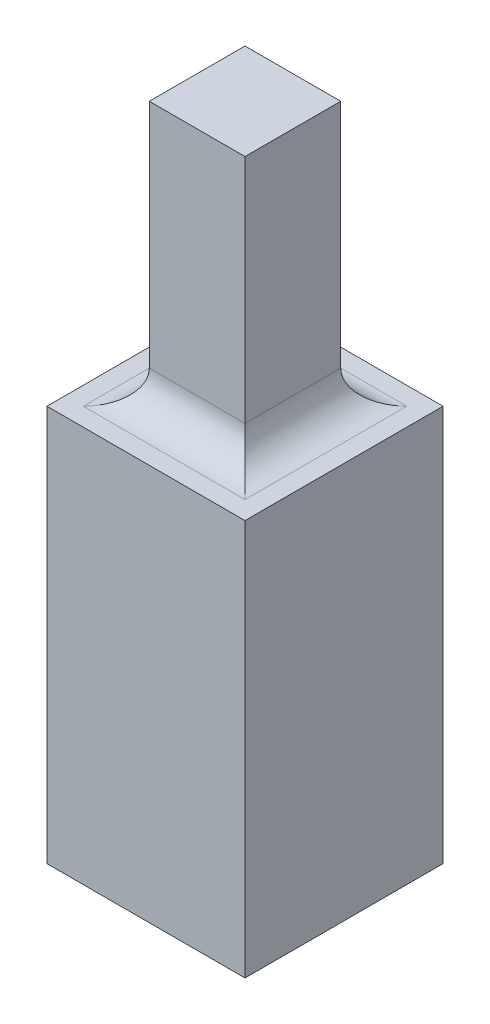
ISO-10303-21;
HEADER;
FILE_DESCRIPTION(('STEP AP214'),'2;1');
FILE_NAME('part.step','',(''),(''),'','','');
FILE_SCHEMA(('AUTOMOTIVE_DESIGN { 1 0 10303 214 1 1 1 1 }'));
ENDSEC;
DATA;
#1=APPLICATION_CONTEXT('core data for automotive mechanical design processes');
#2=APPLICATION_PROTOCOL_DEFINITION('international standard','automotive_design',2000,#1);
#3=PRODUCT_CONTEXT('',#1,'mechanical');
#4=PRODUCT('Part','Part','',(#3));
#5=PRODUCT_RELATED_PRODUCT_CATEGORY('part','',(#4));
#6=PRODUCT_DEFINITION_FORMATION('','',#4);
#7=PRODUCT_DEFINITION_CONTEXT('part definition',#1,'design');
#8=PRODUCT_DEFINITION('design','',#6,#7);
#9=PRODUCT_DEFINITION_SHAPE('','',#8);
#10=(LENGTH_UNIT() NAMED_UNIT(*) SI_UNIT(.MILLI.,.METRE.));
#11=(NAMED_UNIT(*) PLANE_ANGLE_UNIT() SI_UNIT($,.RADIAN.));
#12=(NAMED_UNIT(*) SI_UNIT($,.STERADIAN.) SOLID_ANGLE_UNIT());
#13=UNCERTAINTY_MEASURE_WITH_UNIT(LENGTH_MEASURE(1.E-05),#10,'distance_accuracy_value','');
#14=(GEOMETRIC_REPRESENTATION_CONTEXT(3) GLOBAL_UNCERTAINTY_ASSIGNED_CONTEXT((#13)) GLOBAL_UNIT_ASSIGNED_CONTEXT((#10,
#11,#12)) REPRESENTATION_CONTEXT('',''));
#15=CARTESIAN_POINT('',(0.,0.,0.));
#16=DIRECTION('',(0.,0.,1.));
#17=DIRECTION('',(1.,0.,0.));
#18=AXIS2_PLACEMENT_3D('',#15,#16,#17);
#19=CARTESIAN_POINT('',(0.,60.,0.));
#20=DIRECTION('',(0.,-1.,0.));
#21=DIRECTION('',(0.,0.,-1.));
#22=AXIS2_PLACEMENT_3D('',#19,#20,#21);
#23=PLANE('',#22);
#24=DIRECTION('',(-1.,0.,0.));
#25=VECTOR('',#24,1.);
#26=CARTESIAN_POINT('',(7.25,60.,-12.25));
#27=LINE('',#26,#25);
#28=CARTESIAN_POINT('',(-12.25,60.,-12.25));
#29=VERTEX_POINT('',#28);
#30=CARTESIAN_POINT('',(12.25,60.,-12.25));
#31=VERTEX_POINT('',#30);
#32=EDGE_CURVE('E199',#29,#31,#27,.F.);
#33=ORIENTED_EDGE('',*,*,#32,.T.);
#34=DIRECTION('',(0.,0.,-1.));
#35=VECTOR('',#34,1.);
#36=CARTESIAN_POINT('',(12.25,60.,7.25));
#37=LINE('',#36,#35);
#38=CARTESIAN_POINT('',(12.25,60.,12.25));
#39=VERTEX_POINT('',#38);
#40=EDGE_CURVE('E202',#31,#39,#37,.F.);
#41=ORIENTED_EDGE('',*,*,#40,.T.);
#42=DIRECTION('',(1.,0.,0.));
#43=VECTOR('',#42,1.);
#44=CARTESIAN_POINT('',(-7.25,60.,12.25));
#45=LINE('',#44,#43);
#46=CARTESIAN_POINT('',(-12.25,60.,12.25));
#47=VERTEX_POINT('',#46);
#48=EDGE_CURVE('E193',#39,#47,#45,.F.);
#49=ORIENTED_EDGE('',*,*,#48,.T.);
#50=DIRECTION('',(0.,0.,1.));
#51=VECTOR('',#50,1.);
#52=CARTESIAN_POINT('',(-12.25,60.,-7.25));
#53=LINE('',#52,#51);
#54=EDGE_CURVE('E196',#47,#29,#53,.F.);
#55=ORIENTED_EDGE('',*,*,#54,.T.);
#56=EDGE_LOOP('',(#33,#41,#49,#55));
#57=FACE_BOUND('',#56,.T.);
#58=DIRECTION('',(0.,0.,-1.));
#59=VECTOR('',#58,1.);
#60=CARTESIAN_POINT('',(15.,60.,15.));
#61=LINE('',#60,#59);
#62=CARTESIAN_POINT('',(15.,60.,15.));
#63=VERTEX_POINT('',#62);
#64=CARTESIAN_POINT('',(15.,60.,-15.));
#65=VERTEX_POINT('',#64);
#66=EDGE_CURVE('E154',#63,#65,#61,.T.);
#67=ORIENTED_EDGE('',*,*,#66,.T.);
#68=DIRECTION('',(-1.,0.,0.));
#69=VECTOR('',#68,1.);
#70=CARTESIAN_POINT('',(-15.,60.,-15.));
#71=LINE('',#70,#69);
#72=CARTESIAN_POINT('',(-15.,60.,-15.));
#73=VERTEX_POINT('',#72);
#74=EDGE_CURVE('E158',#65,#73,#71,.T.);
#75=ORIENTED_EDGE('',*,*,#74,.T.);
#76=DIRECTION('',(0.,0.,1.));
#77=VECTOR('',#76,1.);
#78=CARTESIAN_POINT('',(-15.,60.,15.));
#79=LINE('',#78,#77);
#80=CARTESIAN_POINT('',(-15.,60.,15.));
#81=VERTEX_POINT('',#80);
#82=EDGE_CURVE('E162',#73,#81,#79,.T.);
#83=ORIENTED_EDGE('',*,*,#82,.T.);
#84=DIRECTION('',(1.,0.,0.));
#85=VECTOR('',#84,1.);
#86=CARTESIAN_POINT('',(-15.,60.,15.));
#87=LINE('',#86,#85);
#88=EDGE_CURVE('E165',#81,#63,#87,.T.);
#89=ORIENTED_EDGE('',*,*,#88,.T.);
#90=EDGE_LOOP('',(#67,#75,#83,#89));
#91=FACE_BOUND('',#90,.T.);
#92=ADVANCED_FACE('F39',(#57,#91),#23,.F.);
#93=CARTESIAN_POINT('',(15.,60.,15.));
#94=DIRECTION('',(-1.,0.,0.));
#95=DIRECTION('',(0.,0.,1.));
#96=AXIS2_PLACEMENT_3D('',#93,#94,#95);
#97=PLANE('',#96);
#98=DIRECTION('',(0.,0.,-1.));
#99=VECTOR('',#98,1.);
#100=CARTESIAN_POINT('',(15.,0.,15.));
#101=LINE('',#100,#99);
#102=CARTESIAN_POINT('',(15.,0.,15.));
#103=VERTEX_POINT('',#102);
#104=CARTESIAN_POINT('',(15.,0.,-15.));
#105=VERTEX_POINT('',#104);
#106=EDGE_CURVE('E143',#103,#105,#101,.T.);
#107=ORIENTED_EDGE('',*,*,#106,.T.);
#108=DIRECTION('',(0.,-1.,0.));
#109=VECTOR('',#108,1.);
#110=CARTESIAN_POINT('',(15.,60.,-15.));
#111=LINE('',#110,#109);
#112=EDGE_CURVE('E187',#65,#105,#111,.T.);
#113=ORIENTED_EDGE('',*,*,#112,.F.);
#114=ORIENTED_EDGE('',*,*,#66,.F.);
#115=DIRECTION('',(0.,-1.,0.));
#116=VECTOR('',#115,1.);
#117=CARTESIAN_POINT('',(15.,60.,15.));
#118=LINE('',#117,#116);
#119=EDGE_CURVE('E167',#63,#103,#118,.T.);
#120=ORIENTED_EDGE('',*,*,#119,.T.);
#121=EDGE_LOOP('',(#107,#113,#114,#120));
#122=FACE_BOUND('',#121,.T.);
#123=ADVANCED_FACE('F246',(#122),#97,.F.);
#124=CARTESIAN_POINT('',(-15.,60.,-15.));
#125=DIRECTION('',(0.,0.,1.));
#126=DIRECTION('',(1.,0.,0.));
#127=AXIS2_PLACEMENT_3D('',#124,#125,#126);
#128=PLANE('',#127);
#129=DIRECTION('',(-1.,0.,0.));
#130=VECTOR('',#129,1.);
#131=CARTESIAN_POINT('',(-15.,0.,-15.));
#132=LINE('',#131,#130);
#133=CARTESIAN_POINT('',(-15.,0.,-15.));
#134=VERTEX_POINT('',#133);
#135=EDGE_CURVE('E148',#105,#134,#132,.T.);
#136=ORIENTED_EDGE('',*,*,#135,.T.);
#137=DIRECTION('',(0.,-1.,0.));
#138=VECTOR('',#137,1.);
#139=CARTESIAN_POINT('',(-15.,60.,-15.));
#140=LINE('',#139,#138);
#141=EDGE_CURVE('E183',#73,#134,#140,.T.);
#142=ORIENTED_EDGE('',*,*,#141,.F.);
#143=ORIENTED_EDGE('',*,*,#74,.F.);
#144=ORIENTED_EDGE('',*,*,#112,.T.);
#145=EDGE_LOOP('',(#136,#142,#143,#144));
#146=FACE_BOUND('',#145,.T.);
#147=ADVANCED_FACE('F251',(#146),#128,.F.);
#148=CARTESIAN_POINT('',(-15.,60.,15.));
#149=DIRECTION('',(1.,0.,0.));
#150=DIRECTION('',(0.,0.,-1.));
#151=AXIS2_PLACEMENT_3D('',#148,#149,#150);
#152=PLANE('',#151);
#153=DIRECTION('',(0.,0.,1.));
#154=VECTOR('',#153,1.);
#155=CARTESIAN_POINT('',(-15.,0.,15.));
#156=LINE('',#155,#154);
#157=CARTESIAN_POINT('',(-15.,0.,15.));
#158=VERTEX_POINT('',#157);
#159=EDGE_CURVE('E171',#134,#158,#156,.T.);
#160=ORIENTED_EDGE('',*,*,#159,.T.);
#161=DIRECTION('',(0.,-1.,0.));
#162=VECTOR('',#161,1.);
#163=CARTESIAN_POINT('',(-15.,60.,15.));
#164=LINE('',#163,#162);
#165=EDGE_CURVE('E179',#81,#158,#164,.T.);
#166=ORIENTED_EDGE('',*,*,#165,.F.);
#167=ORIENTED_EDGE('',*,*,#82,.F.);
#168=ORIENTED_EDGE('',*,*,#141,.T.);
#169=EDGE_LOOP('',(#160,#166,#167,#168));
#170=FACE_BOUND('',#169,.T.);
#171=ADVANCED_FACE('F264',(#170),#152,.F.);
#172=CARTESIAN_POINT('',(-15.,60.,15.));
#173=DIRECTION('',(0.,0.,-1.));
#174=DIRECTION('',(-1.,0.,0.));
#175=AXIS2_PLACEMENT_3D('',#172,#173,#174);
#176=PLANE('',#175);
#177=DIRECTION('',(1.,0.,0.));
#178=VECTOR('',#177,1.);
#179=CARTESIAN_POINT('',(-15.,0.,15.));
#180=LINE('',#179,#178);
#181=EDGE_CURVE('E159',#158,#103,#180,.T.);
#182=ORIENTED_EDGE('',*,*,#181,.T.);
#183=ORIENTED_EDGE('',*,*,#119,.F.);
#184=ORIENTED_EDGE('',*,*,#88,.F.);
#185=ORIENTED_EDGE('',*,*,#165,.T.);
#186=EDGE_LOOP('',(#182,#183,#184,#185));
#187=FACE_BOUND('',#186,.T.);
#188=ADVANCED_FACE('F260',(#187),#176,.F.);
#189=CARTESIAN_POINT('',(0.,0.,0.));
#190=DIRECTION('',(0.,-1.,0.));
#191=DIRECTION('',(0.,0.,-1.));
#192=AXIS2_PLACEMENT_3D('',#189,#190,#191);
#193=PLANE('',#192);
#194=ORIENTED_EDGE('',*,*,#106,.F.);
#195=ORIENTED_EDGE('',*,*,#181,.F.);
#196=ORIENTED_EDGE('',*,*,#159,.F.);
#197=ORIENTED_EDGE('',*,*,#135,.F.);
#198=EDGE_LOOP('',(#194,#195,#196,#197));
#199=FACE_BOUND('',#198,.T.);
#200=ADVANCED_FACE('F257',(#199),#193,.T.);
#201=CARTESIAN_POINT('',(7.25,100.,7.25));
#202=DIRECTION('',(-1.,0.,0.));
#203=DIRECTION('',(0.,0.,1.));
#204=AXIS2_PLACEMENT_3D('',#201,#202,#203);
#205=PLANE('',#204);
#206=DIRECTION('',(0.,-1.,0.));
#207=VECTOR('',#206,1.);
#208=CARTESIAN_POINT('',(7.25,100.,7.25));
#209=LINE('',#208,#207);
#210=CARTESIAN_POINT('',(7.25,100.,7.25));
#211=VERTEX_POINT('',#210);
#212=CARTESIAN_POINT('',(7.25,65.,7.25));
#213=VERTEX_POINT('',#212);
#214=EDGE_CURVE('E380',#211,#213,#209,.T.);
#215=ORIENTED_EDGE('',*,*,#214,.T.);
#216=DIRECTION('',(0.,0.,-1.));
#217=VECTOR('',#216,1.);
#218=CARTESIAN_POINT('',(7.25,65.,-7.25));
#219=LINE('',#218,#217);
#220=CARTESIAN_POINT('',(7.25,65.,-7.25));
#221=VERTEX_POINT('',#220);
#222=EDGE_CURVE('E141',#213,#221,#219,.T.);
#223=ORIENTED_EDGE('',*,*,#222,.T.);
#224=DIRECTION('',(0.,-1.,0.));
#225=VECTOR('',#224,1.);
#226=CARTESIAN_POINT('',(7.25,100.,-7.25));
#227=LINE('',#226,#225);
#228=CARTESIAN_POINT('',(7.25,100.,-7.25));
#229=VERTEX_POINT('',#228);
#230=EDGE_CURVE('E121',#229,#221,#227,.T.);
#231=ORIENTED_EDGE('',*,*,#230,.F.);
#232=DIRECTION('',(0.,0.,-1.));
#233=VECTOR('',#232,1.);
#234=CARTESIAN_POINT('',(7.25,100.,7.25));
#235=LINE('',#234,#233);
#236=EDGE_CURVE('E127',#211,#229,#235,.T.);
#237=ORIENTED_EDGE('',*,*,#236,.F.);
#238=EDGE_LOOP('',(#215,#223,#231,#237));
#239=FACE_BOUND('',#238,.T.);
#240=ADVANCED_FACE('F139',(#239),#205,.F.);
#241=CARTESIAN_POINT('',(-7.25,100.,-7.25));
#242=DIRECTION('',(0.,0.,1.));
#243=DIRECTION('',(1.,0.,0.));
#244=AXIS2_PLACEMENT_3D('',#241,#242,#243);
#245=PLANE('',#244);
#246=ORIENTED_EDGE('',*,*,#230,.T.);
#247=DIRECTION('',(-1.,0.,0.));
#248=VECTOR('',#247,1.);
#249=CARTESIAN_POINT('',(-7.25,65.,-7.25));
#250=LINE('',#249,#248);
#251=CARTESIAN_POINT('',(-7.25,65.,-7.25));
#252=VERTEX_POINT('',#251);
#253=EDGE_CURVE('E64',#221,#252,#250,.T.);
#254=ORIENTED_EDGE('',*,*,#253,.T.);
#255=DIRECTION('',(0.,-1.,0.));
#256=VECTOR('',#255,1.);
#257=CARTESIAN_POINT('',(-7.25,100.,-7.25));
#258=LINE('',#257,#256);
#259=CARTESIAN_POINT('',(-7.25,100.,-7.25));
#260=VERTEX_POINT('',#259);
#261=EDGE_CURVE('E122',#260,#252,#258,.T.);
#262=ORIENTED_EDGE('',*,*,#261,.F.);
#263=DIRECTION('',(-1.,0.,0.));
#264=VECTOR('',#263,1.);
#265=CARTESIAN_POINT('',(-7.25,100.,-7.25));
#266=LINE('',#265,#264);
#267=EDGE_CURVE('E117',#229,#260,#266,.T.);
#268=ORIENTED_EDGE('',*,*,#267,.F.);
#269=EDGE_LOOP('',(#246,#254,#262,#268));
#270=FACE_BOUND('',#269,.T.);
#271=ADVANCED_FACE('F119',(#270),#245,.F.);
#272=CARTESIAN_POINT('',(-7.25,100.,7.25));
#273=DIRECTION('',(1.,0.,0.));
#274=DIRECTION('',(0.,0.,-1.));
#275=AXIS2_PLACEMENT_3D('',#272,#273,#274);
#276=PLANE('',#275);
#277=ORIENTED_EDGE('',*,*,#261,.T.);
#278=DIRECTION('',(0.,0.,1.));
#279=VECTOR('',#278,1.);
#280=CARTESIAN_POINT('',(-7.25,65.,7.25));
#281=LINE('',#280,#279);
#282=CARTESIAN_POINT('',(-7.25,65.,7.25));
#283=VERTEX_POINT('',#282);
#284=EDGE_CURVE('E49',#252,#283,#281,.T.);
#285=ORIENTED_EDGE('',*,*,#284,.T.);
#286=DIRECTION('',(0.,-1.,0.));
#287=VECTOR('',#286,1.);
#288=CARTESIAN_POINT('',(-7.25,100.,7.25));
#289=LINE('',#288,#287);
#290=CARTESIAN_POINT('',(-7.25,100.,7.25));
#291=VERTEX_POINT('',#290);
#292=EDGE_CURVE('E150',#291,#283,#289,.T.);
#293=ORIENTED_EDGE('',*,*,#292,.F.);
#294=DIRECTION('',(0.,0.,1.));
#295=VECTOR('',#294,1.);
#296=CARTESIAN_POINT('',(-7.25,100.,7.25));
#297=LINE('',#296,#295);
#298=EDGE_CURVE('E126',#260,#291,#297,.T.);
#299=ORIENTED_EDGE('',*,*,#298,.F.);
#300=EDGE_LOOP('',(#277,#285,#293,#299));
#301=FACE_BOUND('',#300,.T.);
#302=ADVANCED_FACE('F309',(#301),#276,.F.);
#303=CARTESIAN_POINT('',(-7.25,100.,7.25));
#304=DIRECTION('',(0.,0.,-1.));
#305=DIRECTION('',(-1.,0.,0.));
#306=AXIS2_PLACEMENT_3D('',#303,#304,#305);
#307=PLANE('',#306);
#308=ORIENTED_EDGE('',*,*,#292,.T.);
#309=DIRECTION('',(1.,0.,0.));
#310=VECTOR('',#309,1.);
#311=CARTESIAN_POINT('',(7.25,65.,7.25));
#312=LINE('',#311,#310);
#313=EDGE_CURVE('E11',#283,#213,#312,.T.);
#314=ORIENTED_EDGE('',*,*,#313,.T.);
#315=ORIENTED_EDGE('',*,*,#214,.F.);
#316=DIRECTION('',(1.,0.,0.));
#317=VECTOR('',#316,1.);
#318=CARTESIAN_POINT('',(-7.25,100.,7.25));
#319=LINE('',#318,#317);
#320=EDGE_CURVE('E132',#291,#211,#319,.T.);
#321=ORIENTED_EDGE('',*,*,#320,.F.);
#322=EDGE_LOOP('',(#308,#314,#315,#321));
#323=FACE_BOUND('',#322,.T.);
#324=ADVANCED_FACE('F315',(#323),#307,.F.);
#325=CARTESIAN_POINT('',(0.,100.,0.));
#326=DIRECTION('',(0.,-1.,0.));
#327=DIRECTION('',(0.,0.,-1.));
#328=AXIS2_PLACEMENT_3D('',#325,#326,#327);
#329=PLANE('',#328);
#330=ORIENTED_EDGE('',*,*,#236,.T.);
#331=ORIENTED_EDGE('',*,*,#267,.T.);
#332=ORIENTED_EDGE('',*,*,#298,.T.);
#333=ORIENTED_EDGE('',*,*,#320,.T.);
#334=EDGE_LOOP('',(#330,#331,#332,#333));
#335=FACE_BOUND('',#334,.T.);
#336=ADVANCED_FACE('F130',(#335),#329,.F.);
#337=CARTESIAN_POINT('',(-12.25,65.,7.25));
#338=DIRECTION('',(0.,0.,-1.));
#339=DIRECTION('',(-1.,0.,0.));
#340=AXIS2_PLACEMENT_3D('',#337,#338,#339);
#341=CYLINDRICAL_SURFACE('',#340,5.);
#342=CARTESIAN_POINT('',(-12.25,65.,-12.25));
#343=DIRECTION('',(0.707106781186547,0.,-0.707106781186547));
#344=DIRECTION('',(-0.707106781186547,0.,-0.707106781186547));
#345=AXIS2_PLACEMENT_3D('',#342,#343,#344);
#346=ELLIPSE('',#345,7.07106781186547,5.);
#347=EDGE_CURVE('E215',#29,#252,#346,.F.);
#348=ORIENTED_EDGE('',*,*,#347,.F.);
#349=ORIENTED_EDGE('',*,*,#54,.F.);
#350=CARTESIAN_POINT('',(-12.25,65.,12.25));
#351=DIRECTION('',(-0.707106781186547,0.,-0.707106781186547));
#352=DIRECTION('',(-0.707106781186547,0.,0.707106781186547));
#353=AXIS2_PLACEMENT_3D('',#350,#351,#352);
#354=ELLIPSE('',#353,7.07106781186547,5.);
#355=EDGE_CURVE('E43',#283,#47,#354,.T.);
#356=ORIENTED_EDGE('',*,*,#355,.F.);
#357=ORIENTED_EDGE('',*,*,#284,.F.);
#358=EDGE_LOOP('',(#348,#349,#356,#357));
#359=FACE_BOUND('',#358,.T.);
#360=ADVANCED_FACE('F41',(#359),#341,.F.);
#361=CARTESIAN_POINT('',(-7.25,65.,12.25));
#362=DIRECTION('',(-1.,0.,0.));
#363=DIRECTION('',(0.,0.,1.));
#364=AXIS2_PLACEMENT_3D('',#361,#362,#363);
#365=CYLINDRICAL_SURFACE('',#364,5.);
#366=ORIENTED_EDGE('',*,*,#355,.T.);
#367=ORIENTED_EDGE('',*,*,#48,.F.);
#368=CARTESIAN_POINT('',(12.25,65.,12.25));
#369=DIRECTION('',(-0.707106781186547,0.,0.707106781186547));
#370=DIRECTION('',(-0.707106781186547,0.,-0.707106781186547));
#371=AXIS2_PLACEMENT_3D('',#368,#369,#370);
#372=ELLIPSE('',#371,7.07106781186547,5.);
#373=EDGE_CURVE('E213',#213,#39,#372,.T.);
#374=ORIENTED_EDGE('',*,*,#373,.F.);
#375=ORIENTED_EDGE('',*,*,#313,.F.);
#376=EDGE_LOOP('',(#366,#367,#374,#375));
#377=FACE_BOUND('',#376,.T.);
#378=ADVANCED_FACE('F227',(#377),#365,.F.);
#379=CARTESIAN_POINT('',(-7.25,65.,-12.25));
#380=DIRECTION('',(1.,0.,0.));
#381=DIRECTION('',(0.,0.,-1.));
#382=AXIS2_PLACEMENT_3D('',#379,#380,#381);
#383=CYLINDRICAL_SURFACE('',#382,5.);
#384=ORIENTED_EDGE('',*,*,#347,.T.);
#385=ORIENTED_EDGE('',*,*,#253,.F.);
#386=CARTESIAN_POINT('',(12.25,65.,-12.25));
#387=DIRECTION('',(0.707106781186547,0.,0.707106781186547));
#388=DIRECTION('',(0.707106781186547,0.,-0.707106781186547));
#389=AXIS2_PLACEMENT_3D('',#386,#387,#388);
#390=ELLIPSE('',#389,7.07106781186547,5.);
#391=EDGE_CURVE('E210',#31,#221,#390,.F.);
#392=ORIENTED_EDGE('',*,*,#391,.F.);
#393=ORIENTED_EDGE('',*,*,#32,.F.);
#394=EDGE_LOOP('',(#384,#385,#392,#393));
#395=FACE_BOUND('',#394,.T.);
#396=ADVANCED_FACE('F237',(#395),#383,.F.);
#397=CARTESIAN_POINT('',(12.25,65.,7.25));
#398=DIRECTION('',(0.,0.,1.));
#399=DIRECTION('',(1.,0.,0.));
#400=AXIS2_PLACEMENT_3D('',#397,#398,#399);
#401=CYLINDRICAL_SURFACE('',#400,5.);
#402=ORIENTED_EDGE('',*,*,#373,.T.);
#403=ORIENTED_EDGE('',*,*,#40,.F.);
#404=ORIENTED_EDGE('',*,*,#391,.T.);
#405=ORIENTED_EDGE('',*,*,#222,.F.);
#406=EDGE_LOOP('',(#402,#403,#404,#405));
#407=FACE_BOUND('',#406,.T.);
#408=ADVANCED_FACE('F236',(#407),#401,.F.);
#409=CLOSED_SHELL('',(#92,#123,#147,#171,#188,#200,#240,#271,#302,#324,#336,#360,#378,#396,#408));
#410=MANIFOLD_SOLID_BREP('B2',#409);
#411=ADVANCED_BREP_SHAPE_REPRESENTATION('',(#18,#410),#14);
#412=SHAPE_DEFINITION_REPRESENTATION(#9,#411);
ENDSEC;
END-ISO-10303-21;
